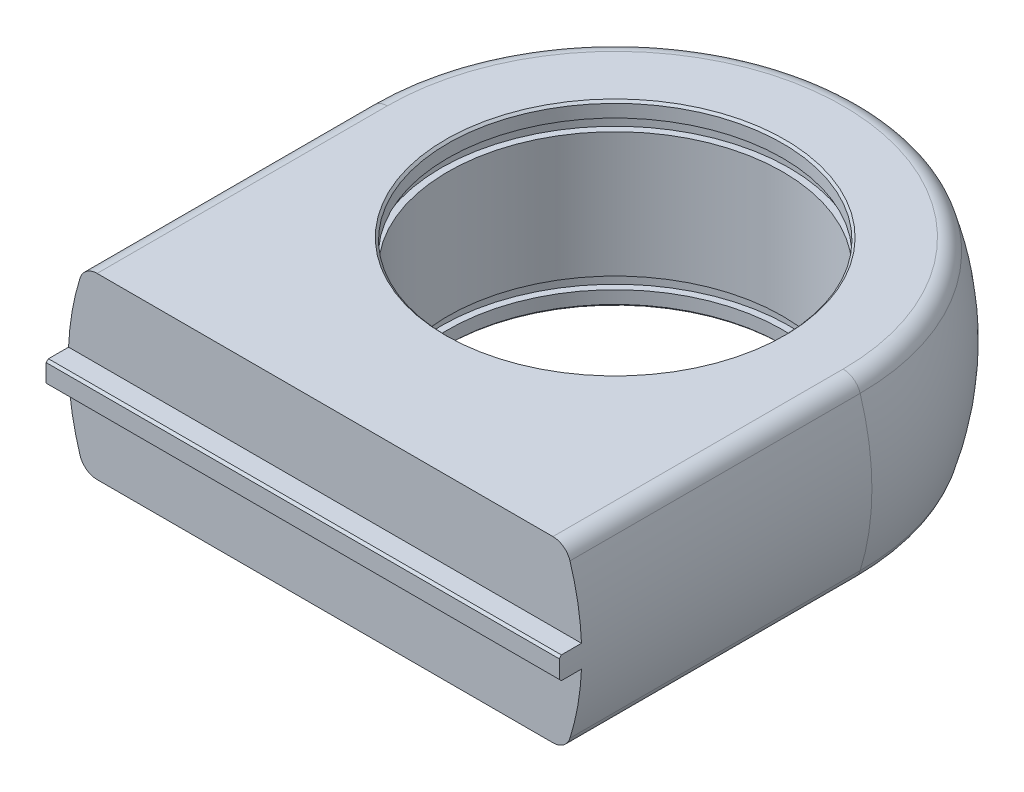
ISO-10303-21;
HEADER;
FILE_DESCRIPTION(('STEP AP214'),'2;1');
FILE_NAME('part.step','',(''),(''),'','','');
FILE_SCHEMA(('AUTOMOTIVE_DESIGN { 1 0 10303 214 1 1 1 1 }'));
ENDSEC;
DATA;
#1=APPLICATION_CONTEXT('core data for automotive mechanical design processes');
#2=APPLICATION_PROTOCOL_DEFINITION('international standard','automotive_design',2000,#1);
#3=PRODUCT_CONTEXT('',#1,'mechanical');
#4=PRODUCT('Part','Part','',(#3));
#5=PRODUCT_RELATED_PRODUCT_CATEGORY('part','',(#4));
#6=PRODUCT_DEFINITION_FORMATION('','',#4);
#7=PRODUCT_DEFINITION_CONTEXT('part definition',#1,'design');
#8=PRODUCT_DEFINITION('design','',#6,#7);
#9=PRODUCT_DEFINITION_SHAPE('','',#8);
#10=(LENGTH_UNIT() NAMED_UNIT(*) SI_UNIT(.MILLI.,.METRE.));
#11=(NAMED_UNIT(*) PLANE_ANGLE_UNIT() SI_UNIT($,.RADIAN.));
#12=(NAMED_UNIT(*) SI_UNIT($,.STERADIAN.) SOLID_ANGLE_UNIT());
#13=UNCERTAINTY_MEASURE_WITH_UNIT(LENGTH_MEASURE(1.E-05),#10,'distance_accuracy_value','');
#14=(GEOMETRIC_REPRESENTATION_CONTEXT(3) GLOBAL_UNCERTAINTY_ASSIGNED_CONTEXT((#13)) GLOBAL_UNIT_ASSIGNED_CONTEXT((#10,
#11,#12)) REPRESENTATION_CONTEXT('',''));
#15=CARTESIAN_POINT('',(0.,0.,0.));
#16=DIRECTION('',(0.,0.,1.));
#17=DIRECTION('',(1.,0.,0.));
#18=AXIS2_PLACEMENT_3D('',#15,#16,#17);
#19=CARTESIAN_POINT('',(0.,0.,0.));
#20=DIRECTION('',(0.,0.,-1.));
#21=DIRECTION('',(-1.,0.,0.));
#22=AXIS2_PLACEMENT_3D('',#19,#20,#21);
#23=PLANE('',#22);
#24=DIRECTION('',(-1.,0.,0.));
#25=VECTOR('',#24,1.);
#26=CARTESIAN_POINT('',(0.,2.5,0.));
#27=LINE('',#26,#25);
#28=CARTESIAN_POINT('',(57.4456264653803,2.5,0.));
#29=VERTEX_POINT('',#28);
#30=CARTESIAN_POINT('',(-57.4456264653803,2.5,0.));
#31=VERTEX_POINT('',#30);
#32=EDGE_CURVE('E169',#29,#31,#27,.T.);
#33=ORIENTED_EDGE('',*,*,#32,.F.);
#34=CARTESIAN_POINT('',(0.,0.,0.));
#35=DIRECTION('',(0.,0.,1.));
#36=DIRECTION('',(1.,0.,0.));
#37=AXIS2_PLACEMENT_3D('',#34,#35,#36);
#38=CIRCLE('',#37,57.5);
#39=CARTESIAN_POINT('',(54.868375082153,17.196261682243,0.));
#40=VERTEX_POINT('',#39);
#41=EDGE_CURVE('E174',#29,#40,#38,.T.);
#42=ORIENTED_EDGE('',*,*,#41,.T.);
#43=CARTESIAN_POINT('',(51.0514446416554,16.,0.));
#44=DIRECTION('',(0.,0.,-1.));
#45=DIRECTION('',(-1.,0.,0.));
#46=AXIS2_PLACEMENT_3D('',#43,#44,#45);
#47=CIRCLE('',#46,4.);
#48=CARTESIAN_POINT('',(51.0514446416554,20.,0.));
#49=VERTEX_POINT('',#48);
#50=EDGE_CURVE('E262',#40,#49,#47,.F.);
#51=ORIENTED_EDGE('',*,*,#50,.T.);
#52=DIRECTION('',(-1.,0.,0.));
#53=VECTOR('',#52,1.);
#54=CARTESIAN_POINT('',(57.5,20.,0.));
#55=LINE('',#54,#53);
#56=CARTESIAN_POINT('',(-51.0514446416553,20.,0.));
#57=VERTEX_POINT('',#56);
#58=EDGE_CURVE('E234',#49,#57,#55,.T.);
#59=ORIENTED_EDGE('',*,*,#58,.T.);
#60=CARTESIAN_POINT('',(-51.0514446416554,16.,0.));
#61=DIRECTION('',(0.,0.,-1.));
#62=DIRECTION('',(-1.,0.,0.));
#63=AXIS2_PLACEMENT_3D('',#60,#61,#62);
#64=CIRCLE('',#63,4.);
#65=CARTESIAN_POINT('',(-54.868375082153,17.196261682243,0.));
#66=VERTEX_POINT('',#65);
#67=EDGE_CURVE('E172',#57,#66,#64,.F.);
#68=ORIENTED_EDGE('',*,*,#67,.T.);
#69=EDGE_CURVE('E158',#66,#31,#38,.T.);
#70=ORIENTED_EDGE('',*,*,#69,.T.);
#71=EDGE_LOOP('',(#33,#42,#51,#59,#68,#70));
#72=FACE_BOUND('',#71,.T.);
#73=ADVANCED_FACE('F50',(#72),#23,.F.);
#74=CARTESIAN_POINT('',(0.,-20.,-65.));
#75=DIRECTION('',(0.,1.,0.));
#76=DIRECTION('',(0.,0.,1.));
#77=AXIS2_PLACEMENT_3D('',#74,#75,#76);
#78=CYLINDRICAL_SURFACE('',#77,37.5);
#79=CARTESIAN_POINT('',(0.,19.5,-65.));
#80=DIRECTION('',(0.,1.,0.));
#81=DIRECTION('',(0.,0.,1.));
#82=AXIS2_PLACEMENT_3D('',#79,#80,#81);
#83=CIRCLE('',#82,37.5);
#84=CARTESIAN_POINT('',(0.,19.5,-27.5));
#85=VERTEX_POINT('',#84);
#86=EDGE_CURVE('E60',#85,#85,#83,.T.);
#87=ORIENTED_EDGE('',*,*,#86,.T.);
#88=EDGE_LOOP('',(#87));
#89=FACE_BOUND('',#88,.T.);
#90=CARTESIAN_POINT('',(0.,16.65,-65.));
#91=DIRECTION('',(0.,-1.,0.));
#92=DIRECTION('',(0.,0.,-1.));
#93=AXIS2_PLACEMENT_3D('',#90,#91,#92);
#94=CIRCLE('',#93,37.5);
#95=CARTESIAN_POINT('',(0.,16.65,-102.5));
#96=VERTEX_POINT('',#95);
#97=EDGE_CURVE('E211',#96,#96,#94,.T.);
#98=ORIENTED_EDGE('',*,*,#97,.T.);
#99=EDGE_LOOP('',(#98));
#100=FACE_BOUND('',#99,.T.);
#101=ADVANCED_FACE('F343',(#89,#100),#78,.F.);
#102=CARTESIAN_POINT('',(0.,-19.5,-65.));
#103=DIRECTION('',(0.,-1.,0.));
#104=DIRECTION('',(0.,0.,-1.));
#105=AXIS2_PLACEMENT_3D('',#102,#103,#104);
#106=CIRCLE('',#105,37.5);
#107=CARTESIAN_POINT('',(0.,-19.5,-102.5));
#108=VERTEX_POINT('',#107);
#109=EDGE_CURVE('E336',#108,#108,#106,.T.);
#110=ORIENTED_EDGE('',*,*,#109,.T.);
#111=EDGE_LOOP('',(#110));
#112=FACE_BOUND('',#111,.T.);
#113=CARTESIAN_POINT('',(0.,-16.65,-65.));
#114=DIRECTION('',(0.,-1.,0.));
#115=DIRECTION('',(0.,0.,-1.));
#116=AXIS2_PLACEMENT_3D('',#113,#114,#115);
#117=CIRCLE('',#116,37.5);
#118=CARTESIAN_POINT('',(0.,-16.65,-102.5));
#119=VERTEX_POINT('',#118);
#120=EDGE_CURVE('E203',#119,#119,#117,.T.);
#121=ORIENTED_EDGE('',*,*,#120,.F.);
#122=EDGE_LOOP('',(#121));
#123=FACE_BOUND('',#122,.T.);
#124=ADVANCED_FACE('F361',(#112,#123),#78,.F.);
#125=CARTESIAN_POINT('',(54.868375082153,-17.196261682243,0.));
#126=VERTEX_POINT('',#125);
#127=CARTESIAN_POINT('',(57.4456264653803,-2.5,0.));
#128=VERTEX_POINT('',#127);
#129=EDGE_CURVE('E177',#126,#128,#38,.T.);
#130=ORIENTED_EDGE('',*,*,#129,.T.);
#131=DIRECTION('',(-1.,0.,0.));
#132=VECTOR('',#131,1.);
#133=CARTESIAN_POINT('',(0.,-2.5,0.));
#134=LINE('',#133,#132);
#135=CARTESIAN_POINT('',(-57.4456264653803,-2.5,0.));
#136=VERTEX_POINT('',#135);
#137=EDGE_CURVE('E180',#128,#136,#134,.T.);
#138=ORIENTED_EDGE('',*,*,#137,.T.);
#139=CARTESIAN_POINT('',(-54.868375082153,-17.196261682243,0.));
#140=VERTEX_POINT('',#139);
#141=EDGE_CURVE('E175',#136,#140,#38,.T.);
#142=ORIENTED_EDGE('',*,*,#141,.T.);
#143=CARTESIAN_POINT('',(-51.0514446416554,-16.,0.));
#144=DIRECTION('',(0.,0.,-1.));
#145=DIRECTION('',(-1.,0.,0.));
#146=AXIS2_PLACEMENT_3D('',#143,#144,#145);
#147=CIRCLE('',#146,4.);
#148=CARTESIAN_POINT('',(-51.0514446416554,-20.,0.));
#149=VERTEX_POINT('',#148);
#150=EDGE_CURVE('E270',#140,#149,#147,.F.);
#151=ORIENTED_EDGE('',*,*,#150,.T.);
#152=DIRECTION('',(1.,0.,0.));
#153=VECTOR('',#152,1.);
#154=CARTESIAN_POINT('',(57.5,-20.,0.));
#155=LINE('',#154,#153);
#156=CARTESIAN_POINT('',(51.0514446416554,-20.,0.));
#157=VERTEX_POINT('',#156);
#158=EDGE_CURVE('E230',#149,#157,#155,.T.);
#159=ORIENTED_EDGE('',*,*,#158,.T.);
#160=CARTESIAN_POINT('',(51.0514446416554,-16.,0.));
#161=DIRECTION('',(0.,0.,-1.));
#162=DIRECTION('',(-1.,0.,0.));
#163=AXIS2_PLACEMENT_3D('',#160,#161,#162);
#164=CIRCLE('',#163,4.);
#165=EDGE_CURVE('E265',#157,#126,#164,.F.);
#166=ORIENTED_EDGE('',*,*,#165,.T.);
#167=EDGE_LOOP('',(#130,#138,#142,#151,#159,#166));
#168=FACE_BOUND('',#167,.T.);
#169=ADVANCED_FACE('F357',(#168),#23,.F.);
#170=CARTESIAN_POINT('',(0.,0.,0.));
#171=DIRECTION('',(0.,0.,1.));
#172=DIRECTION('',(1.,0.,0.));
#173=AXIS2_PLACEMENT_3D('',#170,#171,#172);
#174=CYLINDRICAL_SURFACE('',#173,57.5);
#175=DIRECTION('',(0.,0.,-1.));
#176=VECTOR('',#175,1.);
#177=CARTESIAN_POINT('',(-57.4456264653803,-2.5,5.));
#178=LINE('',#177,#176);
#179=CARTESIAN_POINT('',(-57.4456264653803,-2.5,4.50000000000003));
#180=VERTEX_POINT('',#179);
#181=EDGE_CURVE('E165',#180,#136,#178,.T.);
#182=ORIENTED_EDGE('',*,*,#181,.F.);
#183=CARTESIAN_POINT('',(0.,0.,6.99999999999996));
#184=DIRECTION('',(0.,0.707106781186538,-0.707106781186557));
#185=DIRECTION('',(0.,0.707106781186557,0.707106781186538));
#186=AXIS2_PLACEMENT_3D('',#183,#184,#185);
#187=ELLIPSE('',#186,81.3172798364518,57.5);
#188=CARTESIAN_POINT('',(-57.465206864676,-2.00000000000001,5.));
#189=VERTEX_POINT('',#188);
#190=EDGE_CURVE('E315',#180,#189,#187,.T.);
#191=ORIENTED_EDGE('',*,*,#190,.T.);
#192=CARTESIAN_POINT('',(0.,0.,5.));
#193=DIRECTION('',(0.,0.,1.));
#194=DIRECTION('',(1.,0.,0.));
#195=AXIS2_PLACEMENT_3D('',#192,#193,#194);
#196=CIRCLE('',#195,57.5);
#197=CARTESIAN_POINT('',(-57.465206864676,2.00000000000003,5.));
#198=VERTEX_POINT('',#197);
#199=EDGE_CURVE('E187',#198,#189,#196,.T.);
#200=ORIENTED_EDGE('',*,*,#199,.F.);
#201=CARTESIAN_POINT('',(0.,0.,7.00000000000008));
#202=DIRECTION('',(0.,0.707106781186557,0.707106781186538));
#203=DIRECTION('',(0.,-0.707106781186538,0.707106781186557));
#204=AXIS2_PLACEMENT_3D('',#201,#202,#203);
#205=ELLIPSE('',#204,81.3172798364541,57.5);
#206=CARTESIAN_POINT('',(-57.4456264653803,2.5,4.50000000000001));
#207=VERTEX_POINT('',#206);
#208=EDGE_CURVE('E161',#198,#207,#205,.F.);
#209=ORIENTED_EDGE('',*,*,#208,.T.);
#210=DIRECTION('',(0.,0.,-1.));
#211=VECTOR('',#210,1.);
#212=CARTESIAN_POINT('',(-57.4456264653803,2.5,5.));
#213=LINE('',#212,#211);
#214=EDGE_CURVE('E154',#207,#31,#213,.T.);
#215=ORIENTED_EDGE('',*,*,#214,.T.);
#216=ORIENTED_EDGE('',*,*,#69,.F.);
#217=DIRECTION('',(0.,0.,1.));
#218=VECTOR('',#217,1.);
#219=CARTESIAN_POINT('',(-54.868375082153,17.196261682243,0.));
#220=LINE('',#219,#218);
#221=CARTESIAN_POINT('',(-54.868375082153,17.196261682243,-65.));
#222=VERTEX_POINT('',#221);
#223=EDGE_CURVE('E255',#66,#222,#220,.F.);
#224=ORIENTED_EDGE('',*,*,#223,.T.);
#225=CARTESIAN_POINT('',(0.,0.,-65.));
#226=DIRECTION('',(0.,0.,1.));
#227=DIRECTION('',(1.,0.,0.));
#228=AXIS2_PLACEMENT_3D('',#225,#226,#227);
#229=CIRCLE('',#228,57.5);
#230=CARTESIAN_POINT('',(-54.868375082153,-17.196261682243,-65.));
#231=VERTEX_POINT('',#230);
#232=EDGE_CURVE('E238',#222,#231,#229,.T.);
#233=ORIENTED_EDGE('',*,*,#232,.T.);
#234=DIRECTION('',(0.,0.,1.));
#235=VECTOR('',#234,1.);
#236=CARTESIAN_POINT('',(-54.868375082153,-17.196261682243,0.));
#237=LINE('',#236,#235);
#238=EDGE_CURVE('E258',#231,#140,#237,.T.);
#239=ORIENTED_EDGE('',*,*,#238,.T.);
#240=ORIENTED_EDGE('',*,*,#141,.F.);
#241=EDGE_LOOP('',(#182,#191,#200,#209,#215,#216,#224,#233,#239,#240));
#242=FACE_BOUND('',#241,.T.);
#243=ADVANCED_FACE('F157',(#242),#174,.T.);
#244=CARTESIAN_POINT('',(0.,0.,5.));
#245=DIRECTION('',(0.,0.,1.));
#246=DIRECTION('',(1.,0.,0.));
#247=AXIS2_PLACEMENT_3D('',#244,#245,#246);
#248=CIRCLE('',#247,57.5);
#249=CARTESIAN_POINT('',(57.465206864676,-2.00000000000001,5.));
#250=VERTEX_POINT('',#249);
#251=CARTESIAN_POINT('',(57.465206864676,2.00000000000003,5.));
#252=VERTEX_POINT('',#251);
#253=EDGE_CURVE('E184',#250,#252,#248,.T.);
#254=ORIENTED_EDGE('',*,*,#253,.F.);
#255=CARTESIAN_POINT('',(0.,0.,6.99999999999996));
#256=DIRECTION('',(0.,0.707106781186538,-0.707106781186557));
#257=DIRECTION('',(0.,0.707106781186557,0.707106781186538));
#258=AXIS2_PLACEMENT_3D('',#255,#256,#257);
#259=ELLIPSE('',#258,81.3172798364518,57.5);
#260=CARTESIAN_POINT('',(57.4456264653803,-2.5,4.50000000000003));
#261=VERTEX_POINT('',#260);
#262=EDGE_CURVE('E327',#250,#261,#259,.T.);
#263=ORIENTED_EDGE('',*,*,#262,.T.);
#264=DIRECTION('',(0.,0.,-1.));
#265=VECTOR('',#264,1.);
#266=CARTESIAN_POINT('',(57.4456264653803,-2.5,5.));
#267=LINE('',#266,#265);
#268=EDGE_CURVE('E190',#261,#128,#267,.T.);
#269=ORIENTED_EDGE('',*,*,#268,.T.);
#270=ORIENTED_EDGE('',*,*,#129,.F.);
#271=DIRECTION('',(0.,0.,1.));
#272=VECTOR('',#271,1.);
#273=CARTESIAN_POINT('',(54.868375082153,-17.196261682243,0.));
#274=LINE('',#273,#272);
#275=CARTESIAN_POINT('',(54.868375082153,-17.196261682243,-65.));
#276=VERTEX_POINT('',#275);
#277=EDGE_CURVE('E293',#126,#276,#274,.F.);
#278=ORIENTED_EDGE('',*,*,#277,.T.);
#279=CARTESIAN_POINT('',(54.8683750821529,17.196261682243,-65.));
#280=VERTEX_POINT('',#279);
#281=EDGE_CURVE('E239',#276,#280,#229,.T.);
#282=ORIENTED_EDGE('',*,*,#281,.T.);
#283=DIRECTION('',(0.,0.,1.));
#284=VECTOR('',#283,1.);
#285=CARTESIAN_POINT('',(54.868375082153,17.196261682243,0.));
#286=LINE('',#285,#284);
#287=EDGE_CURVE('E289',#280,#40,#286,.T.);
#288=ORIENTED_EDGE('',*,*,#287,.T.);
#289=ORIENTED_EDGE('',*,*,#41,.F.);
#290=DIRECTION('',(0.,0.,-1.));
#291=VECTOR('',#290,1.);
#292=CARTESIAN_POINT('',(57.4456264653803,2.5,5.));
#293=LINE('',#292,#291);
#294=CARTESIAN_POINT('',(57.4456264653803,2.5,4.50000000000001));
#295=VERTEX_POINT('',#294);
#296=EDGE_CURVE('E164',#295,#29,#293,.T.);
#297=ORIENTED_EDGE('',*,*,#296,.F.);
#298=CARTESIAN_POINT('',(0.,0.,7.00000000000008));
#299=DIRECTION('',(0.,0.707106781186557,0.707106781186538));
#300=DIRECTION('',(0.,-0.707106781186538,0.707106781186557));
#301=AXIS2_PLACEMENT_3D('',#298,#299,#300);
#302=ELLIPSE('',#301,81.3172798364541,57.5);
#303=EDGE_CURVE('E74',#295,#252,#302,.F.);
#304=ORIENTED_EDGE('',*,*,#303,.T.);
#305=EDGE_LOOP('',(#254,#263,#269,#270,#278,#282,#288,#289,#297,#304));
#306=FACE_BOUND('',#305,.T.);
#307=ADVANCED_FACE('F372',(#306),#174,.T.);
#308=CARTESIAN_POINT('',(0.,0.,-65.));
#309=DIRECTION('',(0.,0.,1.));
#310=DIRECTION('',(-1.,0.,0.));
#311=AXIS2_PLACEMENT_3D('',#308,#309,#310);
#312=SPHERICAL_SURFACE('',#311,57.5);
#313=ORIENTED_EDGE('',*,*,#281,.F.);
#314=CARTESIAN_POINT('',(0.,-17.196261682243,-65.));
#315=DIRECTION('',(0.,1.,0.));
#316=DIRECTION('',(0.,0.,1.));
#317=AXIS2_PLACEMENT_3D('',#314,#315,#316);
#318=CIRCLE('',#317,54.868375082153);
#319=EDGE_CURVE('E276',#276,#231,#318,.T.);
#320=ORIENTED_EDGE('',*,*,#319,.T.);
#321=ORIENTED_EDGE('',*,*,#232,.F.);
#322=CARTESIAN_POINT('',(0.,17.196261682243,-65.));
#323=DIRECTION('',(0.,-1.,0.));
#324=DIRECTION('',(0.,0.,-1.));
#325=AXIS2_PLACEMENT_3D('',#322,#323,#324);
#326=CIRCLE('',#325,54.868375082153);
#327=EDGE_CURVE('E273',#222,#280,#326,.T.);
#328=ORIENTED_EDGE('',*,*,#327,.T.);
#329=EDGE_LOOP('',(#313,#320,#321,#328));
#330=FACE_BOUND('',#329,.T.);
#331=ADVANCED_FACE('F407',(#330),#312,.T.);
#332=CARTESIAN_POINT('',(57.5,-20.,-122.5));
#333=DIRECTION('',(0.,-1.,0.));
#334=DIRECTION('',(0.,0.,-1.));
#335=AXIS2_PLACEMENT_3D('',#332,#333,#334);
#336=PLANE('',#335);
#337=CARTESIAN_POINT('',(0.,-20.,-65.));
#338=DIRECTION('',(0.,-1.,0.));
#339=DIRECTION('',(0.,0.,-1.));
#340=AXIS2_PLACEMENT_3D('',#337,#338,#339);
#341=CIRCLE('',#340,38.);
#342=CARTESIAN_POINT('',(0.,-20.,-103.));
#343=VERTEX_POINT('',#342);
#344=EDGE_CURVE('E332',#343,#343,#341,.F.);
#345=ORIENTED_EDGE('',*,*,#344,.T.);
#346=EDGE_LOOP('',(#345));
#347=FACE_BOUND('',#346,.T.);
#348=ORIENTED_EDGE('',*,*,#158,.F.);
#349=DIRECTION('',(0.,0.,-1.));
#350=VECTOR('',#349,1.);
#351=CARTESIAN_POINT('',(-51.0514446416554,-20.,-65.));
#352=LINE('',#351,#350);
#353=CARTESIAN_POINT('',(-51.0514446416554,-20.,-65.));
#354=VERTEX_POINT('',#353);
#355=EDGE_CURVE('E251',#149,#354,#352,.T.);
#356=ORIENTED_EDGE('',*,*,#355,.T.);
#357=CARTESIAN_POINT('',(0.,-20.,-65.));
#358=DIRECTION('',(0.,-1.,0.));
#359=DIRECTION('',(0.,0.,-1.));
#360=AXIS2_PLACEMENT_3D('',#357,#358,#359);
#361=CIRCLE('',#360,51.0514446416554);
#362=CARTESIAN_POINT('',(51.0514446416554,-20.,-65.));
#363=VERTEX_POINT('',#362);
#364=EDGE_CURVE('E248',#354,#363,#361,.T.);
#365=ORIENTED_EDGE('',*,*,#364,.T.);
#366=DIRECTION('',(0.,0.,-1.));
#367=VECTOR('',#366,1.);
#368=CARTESIAN_POINT('',(51.0514446416554,-20.,0.));
#369=LINE('',#368,#367);
#370=EDGE_CURVE('E245',#363,#157,#369,.F.);
#371=ORIENTED_EDGE('',*,*,#370,.T.);
#372=EDGE_LOOP('',(#348,#356,#365,#371));
#373=FACE_BOUND('',#372,.T.);
#374=ADVANCED_FACE('F487',(#347,#373),#336,.T.);
#375=CARTESIAN_POINT('',(57.5,20.,-122.5));
#376=DIRECTION('',(0.,1.,0.));
#377=DIRECTION('',(0.,0.,1.));
#378=AXIS2_PLACEMENT_3D('',#375,#376,#377);
#379=PLANE('',#378);
#380=CARTESIAN_POINT('',(0.,20.,-65.));
#381=DIRECTION('',(0.,1.,0.));
#382=DIRECTION('',(0.,0.,1.));
#383=AXIS2_PLACEMENT_3D('',#380,#381,#382);
#384=CIRCLE('',#383,38.0000000000001);
#385=CARTESIAN_POINT('',(0.,20.,-26.9999999999999));
#386=VERTEX_POINT('',#385);
#387=EDGE_CURVE('E12',#386,#386,#384,.F.);
#388=ORIENTED_EDGE('',*,*,#387,.T.);
#389=EDGE_LOOP('',(#388));
#390=FACE_BOUND('',#389,.T.);
#391=CARTESIAN_POINT('',(0.,20.,-65.));
#392=DIRECTION('',(0.,1.,0.));
#393=DIRECTION('',(0.,0.,1.));
#394=AXIS2_PLACEMENT_3D('',#391,#392,#393);
#395=CIRCLE('',#394,51.0514446416554);
#396=CARTESIAN_POINT('',(51.0514446416553,20.,-65.));
#397=VERTEX_POINT('',#396);
#398=CARTESIAN_POINT('',(-51.0514446416554,20.,-65.));
#399=VERTEX_POINT('',#398);
#400=EDGE_CURVE('E282',#397,#399,#395,.T.);
#401=ORIENTED_EDGE('',*,*,#400,.T.);
#402=DIRECTION('',(0.,0.,-1.));
#403=VECTOR('',#402,1.);
#404=CARTESIAN_POINT('',(-51.0514446416554,20.,0.));
#405=LINE('',#404,#403);
#406=EDGE_CURVE('E285',#399,#57,#405,.F.);
#407=ORIENTED_EDGE('',*,*,#406,.T.);
#408=ORIENTED_EDGE('',*,*,#58,.F.);
#409=DIRECTION('',(0.,0.,-1.));
#410=VECTOR('',#409,1.);
#411=CARTESIAN_POINT('',(51.0514446416553,20.,-65.));
#412=LINE('',#411,#410);
#413=EDGE_CURVE('E279',#49,#397,#412,.T.);
#414=ORIENTED_EDGE('',*,*,#413,.T.);
#415=EDGE_LOOP('',(#401,#407,#408,#414));
#416=FACE_BOUND('',#415,.T.);
#417=ADVANCED_FACE('F399',(#390,#416),#379,.T.);
#418=CARTESIAN_POINT('',(51.0514446416554,-16.,0.));
#419=DIRECTION('',(0.,0.,1.));
#420=DIRECTION('',(1.,0.,0.));
#421=AXIS2_PLACEMENT_3D('',#418,#419,#420);
#422=CYLINDRICAL_SURFACE('',#421,4.);
#423=ORIENTED_EDGE('',*,*,#165,.F.);
#424=ORIENTED_EDGE('',*,*,#370,.F.);
#425=CARTESIAN_POINT('',(51.0514446416553,-16.,-65.));
#426=DIRECTION('',(0.,0.,-1.));
#427=DIRECTION('',(-1.,0.,0.));
#428=AXIS2_PLACEMENT_3D('',#425,#426,#427);
#429=CIRCLE('',#428,4.);
#430=EDGE_CURVE('E235',#276,#363,#429,.T.);
#431=ORIENTED_EDGE('',*,*,#430,.F.);
#432=ORIENTED_EDGE('',*,*,#277,.F.);
#433=EDGE_LOOP('',(#423,#424,#431,#432));
#434=FACE_BOUND('',#433,.T.);
#435=ADVANCED_FACE('F486',(#434),#422,.T.);
#436=CARTESIAN_POINT('',(0.,-16.,-65.));
#437=DIRECTION('',(0.,-1.,0.));
#438=DIRECTION('',(0.,0.,-1.));
#439=AXIS2_PLACEMENT_3D('',#436,#437,#438);
#440=TOROIDAL_SURFACE('',#439,51.0514446416554,4.);
#441=ORIENTED_EDGE('',*,*,#430,.T.);
#442=ORIENTED_EDGE('',*,*,#364,.F.);
#443=CARTESIAN_POINT('',(-51.0514446416554,-16.,-65.));
#444=DIRECTION('',(0.,0.,1.));
#445=DIRECTION('',(1.,0.,0.));
#446=AXIS2_PLACEMENT_3D('',#443,#444,#445);
#447=CIRCLE('',#446,4.);
#448=EDGE_CURVE('E297',#231,#354,#447,.T.);
#449=ORIENTED_EDGE('',*,*,#448,.F.);
#450=ORIENTED_EDGE('',*,*,#319,.F.);
#451=EDGE_LOOP('',(#441,#442,#449,#450));
#452=FACE_BOUND('',#451,.T.);
#453=ADVANCED_FACE('F607',(#452),#440,.T.);
#454=CARTESIAN_POINT('',(-51.0514446416554,-16.,0.));
#455=DIRECTION('',(0.,0.,1.));
#456=DIRECTION('',(1.,0.,0.));
#457=AXIS2_PLACEMENT_3D('',#454,#455,#456);
#458=CYLINDRICAL_SURFACE('',#457,4.);
#459=ORIENTED_EDGE('',*,*,#150,.F.);
#460=ORIENTED_EDGE('',*,*,#238,.F.);
#461=ORIENTED_EDGE('',*,*,#448,.T.);
#462=ORIENTED_EDGE('',*,*,#355,.F.);
#463=EDGE_LOOP('',(#459,#460,#461,#462));
#464=FACE_BOUND('',#463,.T.);
#465=ADVANCED_FACE('F420',(#464),#458,.T.);
#466=CARTESIAN_POINT('',(51.0514446416554,16.,0.));
#467=DIRECTION('',(0.,0.,1.));
#468=DIRECTION('',(1.,0.,0.));
#469=AXIS2_PLACEMENT_3D('',#466,#467,#468);
#470=CYLINDRICAL_SURFACE('',#469,4.);
#471=ORIENTED_EDGE('',*,*,#50,.F.);
#472=ORIENTED_EDGE('',*,*,#287,.F.);
#473=CARTESIAN_POINT('',(51.0514446416553,16.,-65.));
#474=DIRECTION('',(0.,0.,-1.));
#475=DIRECTION('',(-1.,0.,0.));
#476=AXIS2_PLACEMENT_3D('',#473,#474,#475);
#477=CIRCLE('',#476,4.);
#478=EDGE_CURVE('E300',#397,#280,#477,.T.);
#479=ORIENTED_EDGE('',*,*,#478,.F.);
#480=ORIENTED_EDGE('',*,*,#413,.F.);
#481=EDGE_LOOP('',(#471,#472,#479,#480));
#482=FACE_BOUND('',#481,.T.);
#483=ADVANCED_FACE('F396',(#482),#470,.T.);
#484=CARTESIAN_POINT('',(0.,16.,-65.));
#485=DIRECTION('',(0.,1.,0.));
#486=DIRECTION('',(0.,0.,1.));
#487=AXIS2_PLACEMENT_3D('',#484,#485,#486);
#488=TOROIDAL_SURFACE('',#487,51.0514446416554,4.);
#489=ORIENTED_EDGE('',*,*,#478,.T.);
#490=ORIENTED_EDGE('',*,*,#327,.F.);
#491=CARTESIAN_POINT('',(-51.0514446416554,16.,-65.));
#492=DIRECTION('',(0.,0.,1.));
#493=DIRECTION('',(1.,0.,0.));
#494=AXIS2_PLACEMENT_3D('',#491,#492,#493);
#495=CIRCLE('',#494,4.);
#496=EDGE_CURVE('E215',#399,#222,#495,.T.);
#497=ORIENTED_EDGE('',*,*,#496,.F.);
#498=ORIENTED_EDGE('',*,*,#400,.F.);
#499=EDGE_LOOP('',(#489,#490,#497,#498));
#500=FACE_BOUND('',#499,.T.);
#501=ADVANCED_FACE('F411',(#500),#488,.T.);
#502=CARTESIAN_POINT('',(-51.0514446416554,16.,0.));
#503=DIRECTION('',(0.,0.,1.));
#504=DIRECTION('',(1.,0.,0.));
#505=AXIS2_PLACEMENT_3D('',#502,#503,#504);
#506=CYLINDRICAL_SURFACE('',#505,4.);
#507=ORIENTED_EDGE('',*,*,#496,.T.);
#508=ORIENTED_EDGE('',*,*,#223,.F.);
#509=ORIENTED_EDGE('',*,*,#67,.F.);
#510=ORIENTED_EDGE('',*,*,#406,.F.);
#511=EDGE_LOOP('',(#507,#508,#509,#510));
#512=FACE_BOUND('',#511,.T.);
#513=ADVANCED_FACE('F403',(#512),#506,.T.);
#514=CARTESIAN_POINT('',(0.,-16.65,-102.5));
#515=DIRECTION('',(0.,-1.,0.));
#516=DIRECTION('',(0.,0.,-1.));
#517=AXIS2_PLACEMENT_3D('',#514,#515,#516);
#518=PLANE('',#517);
#519=CARTESIAN_POINT('',(0.,-16.65,-65.));
#520=DIRECTION('',(0.,-1.,0.));
#521=DIRECTION('',(0.,0.,-1.));
#522=AXIS2_PLACEMENT_3D('',#519,#520,#521);
#523=CIRCLE('',#522,39.);
#524=CARTESIAN_POINT('',(0.,-16.65,-104.));
#525=VERTEX_POINT('',#524);
#526=EDGE_CURVE('E223',#525,#525,#523,.T.);
#527=ORIENTED_EDGE('',*,*,#526,.F.);
#528=EDGE_LOOP('',(#527));
#529=FACE_BOUND('',#528,.T.);
#530=ORIENTED_EDGE('',*,*,#120,.T.);
#531=EDGE_LOOP('',(#530));
#532=FACE_BOUND('',#531,.T.);
#533=ADVANCED_FACE('F418',(#529,#532),#518,.F.);
#534=CARTESIAN_POINT('',(0.,-20.,-65.));
#535=DIRECTION('',(0.,-1.,0.));
#536=DIRECTION('',(0.,0.,-1.));
#537=AXIS2_PLACEMENT_3D('',#534,#535,#536);
#538=CYLINDRICAL_SURFACE('',#537,39.);
#539=CARTESIAN_POINT('',(0.,-14.,-65.));
#540=DIRECTION('',(0.,-1.,0.));
#541=DIRECTION('',(0.,0.,-1.));
#542=AXIS2_PLACEMENT_3D('',#539,#540,#541);
#543=CIRCLE('',#542,39.);
#544=CARTESIAN_POINT('',(0.,-14.,-104.));
#545=VERTEX_POINT('',#544);
#546=EDGE_CURVE('E219',#545,#545,#543,.T.);
#547=ORIENTED_EDGE('',*,*,#546,.F.);
#548=EDGE_LOOP('',(#547));
#549=FACE_BOUND('',#548,.T.);
#550=ORIENTED_EDGE('',*,*,#526,.T.);
#551=EDGE_LOOP('',(#550));
#552=FACE_BOUND('',#551,.T.);
#553=ADVANCED_FACE('F474',(#549,#552),#538,.F.);
#554=CARTESIAN_POINT('',(0.,-14.,-102.5));
#555=DIRECTION('',(0.,1.,0.));
#556=DIRECTION('',(0.,0.,1.));
#557=AXIS2_PLACEMENT_3D('',#554,#555,#556);
#558=PLANE('',#557);
#559=CARTESIAN_POINT('',(0.,-14.,-65.));
#560=DIRECTION('',(0.,-1.,0.));
#561=DIRECTION('',(0.,0.,-1.));
#562=AXIS2_PLACEMENT_3D('',#559,#560,#561);
#563=CIRCLE('',#562,37.5);
#564=CARTESIAN_POINT('',(0.,-14.,-102.5));
#565=VERTEX_POINT('',#564);
#566=EDGE_CURVE('E197',#565,#565,#563,.T.);
#567=ORIENTED_EDGE('',*,*,#566,.F.);
#568=EDGE_LOOP('',(#567));
#569=FACE_BOUND('',#568,.T.);
#570=ORIENTED_EDGE('',*,*,#546,.T.);
#571=EDGE_LOOP('',(#570));
#572=FACE_BOUND('',#571,.T.);
#573=ADVANCED_FACE('F470',(#569,#572),#558,.F.);
#574=CARTESIAN_POINT('',(0.,16.65,-102.5));
#575=DIRECTION('',(0.,1.,0.));
#576=DIRECTION('',(0.,0.,1.));
#577=AXIS2_PLACEMENT_3D('',#574,#575,#576);
#578=PLANE('',#577);
#579=ORIENTED_EDGE('',*,*,#97,.F.);
#580=EDGE_LOOP('',(#579));
#581=FACE_BOUND('',#580,.T.);
#582=CARTESIAN_POINT('',(0.,16.65,-65.));
#583=DIRECTION('',(0.,-1.,0.));
#584=DIRECTION('',(0.,0.,-1.));
#585=AXIS2_PLACEMENT_3D('',#582,#583,#584);
#586=CIRCLE('',#585,39.);
#587=CARTESIAN_POINT('',(0.,16.65,-104.));
#588=VERTEX_POINT('',#587);
#589=EDGE_CURVE('E207',#588,#588,#586,.T.);
#590=ORIENTED_EDGE('',*,*,#589,.T.);
#591=EDGE_LOOP('',(#590));
#592=FACE_BOUND('',#591,.T.);
#593=ADVANCED_FACE('F466',(#581,#592),#578,.F.);
#594=CARTESIAN_POINT('',(0.,-20.,-65.));
#595=DIRECTION('',(0.,-1.,0.));
#596=DIRECTION('',(0.,0.,-1.));
#597=AXIS2_PLACEMENT_3D('',#594,#595,#596);
#598=CYLINDRICAL_SURFACE('',#597,39.);
#599=ORIENTED_EDGE('',*,*,#589,.F.);
#600=EDGE_LOOP('',(#599));
#601=FACE_BOUND('',#600,.T.);
#602=CARTESIAN_POINT('',(0.,14.,-65.));
#603=DIRECTION('',(0.,-1.,0.));
#604=DIRECTION('',(0.,0.,-1.));
#605=AXIS2_PLACEMENT_3D('',#602,#603,#604);
#606=CIRCLE('',#605,39.);
#607=CARTESIAN_POINT('',(0.,14.,-104.));
#608=VERTEX_POINT('',#607);
#609=EDGE_CURVE('E202',#608,#608,#606,.T.);
#610=ORIENTED_EDGE('',*,*,#609,.T.);
#611=EDGE_LOOP('',(#610));
#612=FACE_BOUND('',#611,.T.);
#613=ADVANCED_FACE('F462',(#601,#612),#598,.F.);
#614=CARTESIAN_POINT('',(0.,14.,-102.5));
#615=DIRECTION('',(0.,-1.,0.));
#616=DIRECTION('',(0.,0.,-1.));
#617=AXIS2_PLACEMENT_3D('',#614,#615,#616);
#618=PLANE('',#617);
#619=ORIENTED_EDGE('',*,*,#609,.F.);
#620=EDGE_LOOP('',(#619));
#621=FACE_BOUND('',#620,.T.);
#622=CARTESIAN_POINT('',(0.,14.,-65.));
#623=DIRECTION('',(0.,-1.,0.));
#624=DIRECTION('',(0.,0.,-1.));
#625=AXIS2_PLACEMENT_3D('',#622,#623,#624);
#626=CIRCLE('',#625,37.5);
#627=CARTESIAN_POINT('',(0.,14.,-102.5));
#628=VERTEX_POINT('',#627);
#629=EDGE_CURVE('E198',#628,#628,#626,.T.);
#630=ORIENTED_EDGE('',*,*,#629,.T.);
#631=EDGE_LOOP('',(#630));
#632=FACE_BOUND('',#631,.T.);
#633=ADVANCED_FACE('F459',(#621,#632),#618,.F.);
#634=ORIENTED_EDGE('',*,*,#629,.F.);
#635=EDGE_LOOP('',(#634));
#636=FACE_BOUND('',#635,.T.);
#637=ORIENTED_EDGE('',*,*,#566,.T.);
#638=EDGE_LOOP('',(#637));
#639=FACE_BOUND('',#638,.T.);
#640=ADVANCED_FACE('F363',(#636,#639),#78,.F.);
#641=CARTESIAN_POINT('',(0.,2.5,5.));
#642=DIRECTION('',(0.,-1.,0.));
#643=DIRECTION('',(0.,0.,-1.));
#644=AXIS2_PLACEMENT_3D('',#641,#642,#643);
#645=PLANE('',#644);
#646=ORIENTED_EDGE('',*,*,#214,.F.);
#647=DIRECTION('',(1.,0.,0.));
#648=VECTOR('',#647,1.);
#649=CARTESIAN_POINT('',(57.4456264653803,2.5,4.50000000000001));
#650=LINE('',#649,#648);
#651=EDGE_CURVE('E67',#207,#295,#650,.T.);
#652=ORIENTED_EDGE('',*,*,#651,.T.);
#653=ORIENTED_EDGE('',*,*,#296,.T.);
#654=ORIENTED_EDGE('',*,*,#32,.T.);
#655=EDGE_LOOP('',(#646,#652,#653,#654));
#656=FACE_BOUND('',#655,.T.);
#657=ADVANCED_FACE('F178',(#656),#645,.F.);
#658=CARTESIAN_POINT('',(0.,-2.5,5.));
#659=DIRECTION('',(0.,-1.,0.));
#660=DIRECTION('',(0.,0.,-1.));
#661=AXIS2_PLACEMENT_3D('',#658,#659,#660);
#662=PLANE('',#661);
#663=ORIENTED_EDGE('',*,*,#268,.F.);
#664=DIRECTION('',(-1.,0.,0.));
#665=VECTOR('',#664,1.);
#666=CARTESIAN_POINT('',(0.,-2.5,4.50000000000003));
#667=LINE('',#666,#665);
#668=EDGE_CURVE('E296',#261,#180,#667,.T.);
#669=ORIENTED_EDGE('',*,*,#668,.T.);
#670=ORIENTED_EDGE('',*,*,#181,.T.);
#671=ORIENTED_EDGE('',*,*,#137,.F.);
#672=EDGE_LOOP('',(#663,#669,#670,#671));
#673=FACE_BOUND('',#672,.T.);
#674=ADVANCED_FACE('F381',(#673),#662,.T.);
#675=CARTESIAN_POINT('',(0.,0.,5.));
#676=DIRECTION('',(0.,0.,1.));
#677=DIRECTION('',(1.,0.,0.));
#678=AXIS2_PLACEMENT_3D('',#675,#676,#677);
#679=PLANE('',#678);
#680=ORIENTED_EDGE('',*,*,#199,.T.);
#681=DIRECTION('',(1.,0.,0.));
#682=VECTOR('',#681,1.);
#683=CARTESIAN_POINT('',(0.,-2.00000000000001,5.));
#684=LINE('',#683,#682);
#685=EDGE_CURVE('E322',#189,#250,#684,.T.);
#686=ORIENTED_EDGE('',*,*,#685,.T.);
#687=ORIENTED_EDGE('',*,*,#253,.T.);
#688=DIRECTION('',(-1.,0.,0.));
#689=VECTOR('',#688,1.);
#690=CARTESIAN_POINT('',(-57.4456264653803,2.00000000000003,5.));
#691=LINE('',#690,#689);
#692=EDGE_CURVE('E318',#252,#198,#691,.T.);
#693=ORIENTED_EDGE('',*,*,#692,.T.);
#694=EDGE_LOOP('',(#680,#686,#687,#693));
#695=FACE_BOUND('',#694,.T.);
#696=ADVANCED_FACE('F431',(#695),#679,.T.);
#697=CARTESIAN_POINT('',(0.,-2.5,4.50000000000003));
#698=DIRECTION('',(0.,0.707106781186538,-0.707106781186557));
#699=DIRECTION('',(-1.,0.,0.));
#700=AXIS2_PLACEMENT_3D('',#697,#698,#699);
#701=PLANE('',#700);
#702=ORIENTED_EDGE('',*,*,#262,.F.);
#703=ORIENTED_EDGE('',*,*,#685,.F.);
#704=ORIENTED_EDGE('',*,*,#190,.F.);
#705=ORIENTED_EDGE('',*,*,#668,.F.);
#706=EDGE_LOOP('',(#702,#703,#704,#705));
#707=FACE_BOUND('',#706,.T.);
#708=ADVANCED_FACE('F425',(#707),#701,.F.);
#709=CARTESIAN_POINT('',(0.,2.00000000000003,5.));
#710=DIRECTION('',(0.,0.707106781186557,0.707106781186538));
#711=DIRECTION('',(1.,0.,0.));
#712=AXIS2_PLACEMENT_3D('',#709,#710,#711);
#713=PLANE('',#712);
#714=ORIENTED_EDGE('',*,*,#303,.F.);
#715=ORIENTED_EDGE('',*,*,#651,.F.);
#716=ORIENTED_EDGE('',*,*,#208,.F.);
#717=ORIENTED_EDGE('',*,*,#692,.F.);
#718=EDGE_LOOP('',(#714,#715,#716,#717));
#719=FACE_BOUND('',#718,.T.);
#720=ADVANCED_FACE('F352',(#719),#713,.T.);
#721=CARTESIAN_POINT('',(0.,-20.,-65.));
#722=DIRECTION('',(0.,-1.,0.));
#723=DIRECTION('',(0.,0.,-1.));
#724=AXIS2_PLACEMENT_3D('',#721,#722,#723);
#725=CONICAL_SURFACE('',#724,38.,0.785398163397469);
#726=ORIENTED_EDGE('',*,*,#109,.F.);
#727=EDGE_LOOP('',(#726));
#728=FACE_BOUND('',#727,.T.);
#729=ORIENTED_EDGE('',*,*,#344,.F.);
#730=EDGE_LOOP('',(#729));
#731=FACE_BOUND('',#730,.T.);
#732=ADVANCED_FACE('F347',(#728,#731),#725,.F.);
#733=CARTESIAN_POINT('',(0.,19.5,-65.));
#734=DIRECTION('',(0.,1.,0.));
#735=DIRECTION('',(0.,0.,1.));
#736=AXIS2_PLACEMENT_3D('',#733,#734,#735);
#737=CONICAL_SURFACE('',#736,37.5,0.785398163397462);
#738=ORIENTED_EDGE('',*,*,#387,.F.);
#739=EDGE_LOOP('',(#738));
#740=FACE_BOUND('',#739,.T.);
#741=ORIENTED_EDGE('',*,*,#86,.F.);
#742=EDGE_LOOP('',(#741));
#743=FACE_BOUND('',#742,.T.);
#744=ADVANCED_FACE('F53',(#740,#743),#737,.F.);
#745=CLOSED_SHELL('',(#73,#101,#124,#169,#243,#307,#331,#374,#417,#435,#453,#465,#483,#501,#513,
#533,#553,#573,#593,#613,#633,#640,#657,#674,#696,#708,#720,#732,#744));
#746=MANIFOLD_SOLID_BREP('B2',#745);
#747=ADVANCED_BREP_SHAPE_REPRESENTATION('',(#18,#746),#14);
#748=SHAPE_DEFINITION_REPRESENTATION(#9,#747);
ENDSEC;
END-ISO-10303-21;
